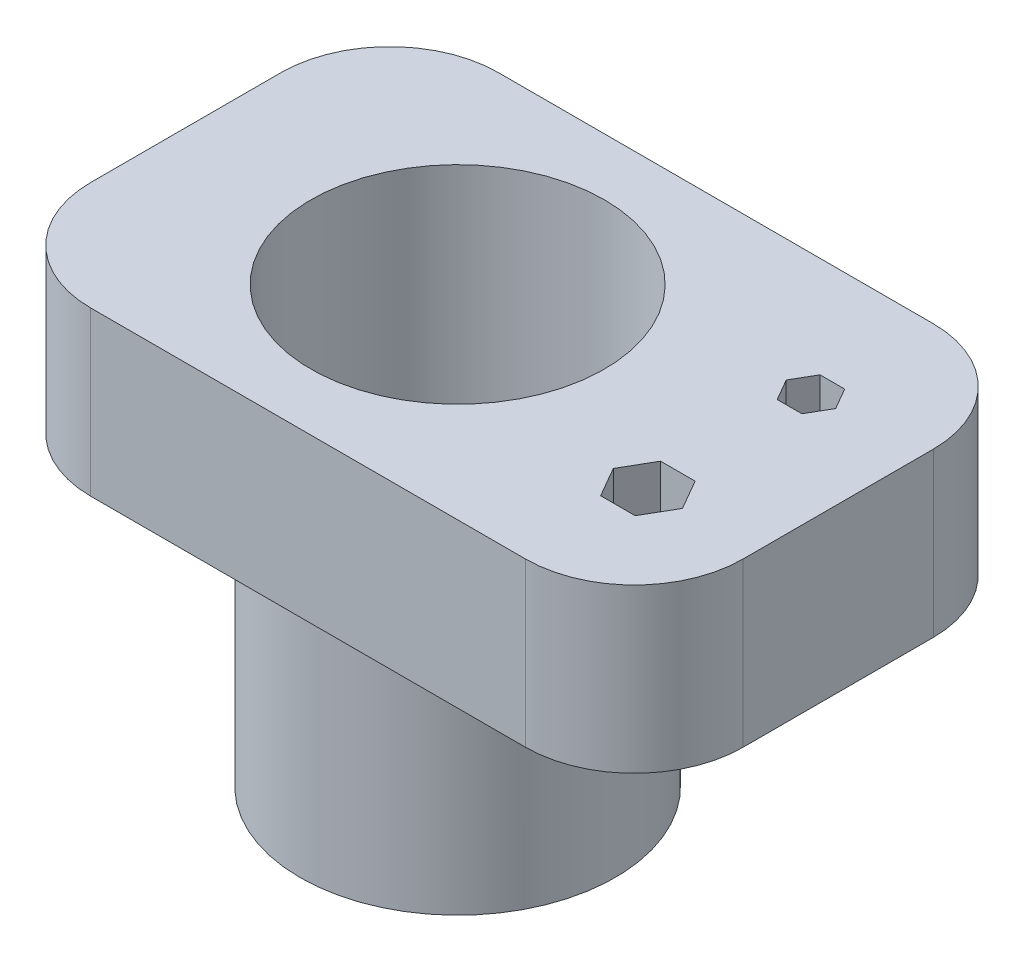
ISO-10303-21;
HEADER;
FILE_DESCRIPTION(('STEP AP214'),'2;1');
FILE_NAME('part.step','',(''),(''),'','','');
FILE_SCHEMA(('AUTOMOTIVE_DESIGN { 1 0 10303 214 1 1 1 1 }'));
ENDSEC;
DATA;
#1=APPLICATION_CONTEXT('core data for automotive mechanical design processes');
#2=APPLICATION_PROTOCOL_DEFINITION('international standard','automotive_design',2000,#1);
#3=PRODUCT_CONTEXT('',#1,'mechanical');
#4=PRODUCT('Part','Part','',(#3));
#5=PRODUCT_RELATED_PRODUCT_CATEGORY('part','',(#4));
#6=PRODUCT_DEFINITION_FORMATION('','',#4);
#7=PRODUCT_DEFINITION_CONTEXT('part definition',#1,'design');
#8=PRODUCT_DEFINITION('design','',#6,#7);
#9=PRODUCT_DEFINITION_SHAPE('','',#8);
#10=(LENGTH_UNIT() NAMED_UNIT(*) SI_UNIT(.MILLI.,.METRE.));
#11=(NAMED_UNIT(*) PLANE_ANGLE_UNIT() SI_UNIT($,.RADIAN.));
#12=(NAMED_UNIT(*) SI_UNIT($,.STERADIAN.) SOLID_ANGLE_UNIT());
#13=UNCERTAINTY_MEASURE_WITH_UNIT(LENGTH_MEASURE(1.E-05),#10,'distance_accuracy_value','');
#14=(GEOMETRIC_REPRESENTATION_CONTEXT(3) GLOBAL_UNCERTAINTY_ASSIGNED_CONTEXT((#13)) GLOBAL_UNIT_ASSIGNED_CONTEXT((#10,
#11,#12)) REPRESENTATION_CONTEXT('',''));
#15=CARTESIAN_POINT('',(0.,0.,0.));
#16=DIRECTION('',(0.,0.,1.));
#17=DIRECTION('',(1.,0.,0.));
#18=AXIS2_PLACEMENT_3D('',#15,#16,#17);
#19=CARTESIAN_POINT('',(0.,6.35,0.));
#20=DIRECTION('',(0.,-1.,0.));
#21=DIRECTION('',(0.,0.,-1.));
#22=AXIS2_PLACEMENT_3D('',#19,#20,#21);
#23=CYLINDRICAL_SURFACE('',#22,3.683);
#24=CARTESIAN_POINT('',(0.,6.35,0.));
#25=DIRECTION('',(0.,1.,0.));
#26=DIRECTION('',(0.,0.,1.));
#27=AXIS2_PLACEMENT_3D('',#24,#25,#26);
#28=CIRCLE('',#27,3.683);
#29=CARTESIAN_POINT('',(0.,6.35,3.683));
#30=VERTEX_POINT('',#29);
#31=EDGE_CURVE('E357',#30,#30,#28,.T.);
#32=ORIENTED_EDGE('',*,*,#31,.F.);
#33=EDGE_LOOP('',(#32));
#34=FACE_BOUND('',#33,.T.);
#35=CARTESIAN_POINT('',(0.,0.,0.));
#36=DIRECTION('',(0.,1.,0.));
#37=DIRECTION('',(0.,0.,1.));
#38=AXIS2_PLACEMENT_3D('',#35,#36,#37);
#39=CIRCLE('',#38,3.683);
#40=CARTESIAN_POINT('',(0.,0.,3.683));
#41=VERTEX_POINT('',#40);
#42=EDGE_CURVE('E343',#41,#41,#39,.T.);
#43=ORIENTED_EDGE('',*,*,#42,.T.);
#44=EDGE_LOOP('',(#43));
#45=FACE_BOUND('',#44,.T.);
#46=ADVANCED_FACE('F41',(#34,#45),#23,.T.);
#47=CARTESIAN_POINT('',(0.,6.35,0.));
#48=DIRECTION('',(0.,-1.,0.));
#49=DIRECTION('',(0.,0.,-1.));
#50=AXIS2_PLACEMENT_3D('',#47,#48,#49);
#51=CYLINDRICAL_SURFACE('',#50,3.429);
#52=CARTESIAN_POINT('',(0.,1.10716033165933,0.));
#53=DIRECTION('',(0.,-1.,0.));
#54=DIRECTION('',(0.,0.,-1.));
#55=AXIS2_PLACEMENT_3D('',#52,#53,#54);
#56=CIRCLE('',#55,3.429);
#57=CARTESIAN_POINT('',(0.,1.10716033165933,-3.429));
#58=VERTEX_POINT('',#57);
#59=EDGE_CURVE('E361',#58,#58,#56,.T.);
#60=ORIENTED_EDGE('',*,*,#59,.T.);
#61=EDGE_LOOP('',(#60));
#62=FACE_BOUND('',#61,.T.);
#63=CARTESIAN_POINT('',(0.,10.16,0.));
#64=DIRECTION('',(0.,-1.,0.));
#65=DIRECTION('',(0.,0.,-1.));
#66=AXIS2_PLACEMENT_3D('',#63,#64,#65);
#67=CIRCLE('',#66,3.429);
#68=CARTESIAN_POINT('',(0.,10.16,-3.429));
#69=VERTEX_POINT('',#68);
#70=EDGE_CURVE('E247',#69,#69,#67,.T.);
#71=ORIENTED_EDGE('',*,*,#70,.F.);
#72=EDGE_LOOP('',(#71));
#73=FACE_BOUND('',#72,.T.);
#74=ADVANCED_FACE('F450',(#62,#73),#51,.F.);
#75=CARTESIAN_POINT('',(0.,1.10716033165933,0.));
#76=DIRECTION('',(0.,-1.,0.));
#77=DIRECTION('',(0.,0.,-1.));
#78=AXIS2_PLACEMENT_3D('',#75,#76,#77);
#79=TOROIDAL_SURFACE('',#78,5.969,2.54);
#80=ORIENTED_EDGE('',*,*,#59,.F.);
#81=EDGE_LOOP('',(#80));
#82=FACE_BOUND('',#81,.T.);
#83=ORIENTED_EDGE('',*,*,#42,.F.);
#84=EDGE_LOOP('',(#83));
#85=FACE_BOUND('',#84,.T.);
#86=ADVANCED_FACE('F456',(#82,#85),#79,.T.);
#87=CARTESIAN_POINT('',(-6.35,10.16,-4.7625));
#88=DIRECTION('',(1.,0.,0.));
#89=DIRECTION('',(0.,0.,-1.));
#90=AXIS2_PLACEMENT_3D('',#87,#88,#89);
#91=PLANE('',#90);
#92=DIRECTION('',(0.,0.,1.));
#93=VECTOR('',#92,1.);
#94=CARTESIAN_POINT('',(-6.35,6.35,-4.7625));
#95=LINE('',#94,#93);
#96=CARTESIAN_POINT('',(-6.35,6.35,-2.2225));
#97=VERTEX_POINT('',#96);
#98=CARTESIAN_POINT('',(-6.35,6.35,2.2225));
#99=VERTEX_POINT('',#98);
#100=EDGE_CURVE('E327',#97,#99,#95,.T.);
#101=ORIENTED_EDGE('',*,*,#100,.T.);
#102=DIRECTION('',(0.,-1.,0.));
#103=VECTOR('',#102,1.);
#104=CARTESIAN_POINT('',(-6.35,10.16,2.2225));
#105=LINE('',#104,#103);
#106=CARTESIAN_POINT('',(-6.35,10.16,2.2225));
#107=VERTEX_POINT('',#106);
#108=EDGE_CURVE('E391',#99,#107,#105,.F.);
#109=ORIENTED_EDGE('',*,*,#108,.T.);
#110=DIRECTION('',(0.,0.,1.));
#111=VECTOR('',#110,1.);
#112=CARTESIAN_POINT('',(-6.35,10.16,-4.7625));
#113=LINE('',#112,#111);
#114=CARTESIAN_POINT('',(-6.35,10.16,-2.2225));
#115=VERTEX_POINT('',#114);
#116=EDGE_CURVE('E328',#115,#107,#113,.T.);
#117=ORIENTED_EDGE('',*,*,#116,.F.);
#118=DIRECTION('',(0.,-1.,0.));
#119=VECTOR('',#118,1.);
#120=CARTESIAN_POINT('',(-6.35,10.16,-2.2225));
#121=LINE('',#120,#119);
#122=EDGE_CURVE('E387',#115,#97,#121,.T.);
#123=ORIENTED_EDGE('',*,*,#122,.T.);
#124=EDGE_LOOP('',(#101,#109,#117,#123));
#125=FACE_BOUND('',#124,.T.);
#126=ADVANCED_FACE('F435',(#125),#91,.F.);
#127=CARTESIAN_POINT('',(8.89,10.16,4.7625));
#128=DIRECTION('',(0.,0.,-1.));
#129=DIRECTION('',(-1.,0.,0.));
#130=AXIS2_PLACEMENT_3D('',#127,#128,#129);
#131=PLANE('',#130);
#132=DIRECTION('',(1.,0.,0.));
#133=VECTOR('',#132,1.);
#134=CARTESIAN_POINT('',(8.89,10.16,4.7625));
#135=LINE('',#134,#133);
#136=CARTESIAN_POINT('',(-3.81,10.16,4.7625));
#137=VERTEX_POINT('',#136);
#138=CARTESIAN_POINT('',(6.35,10.16,4.7625));
#139=VERTEX_POINT('',#138);
#140=EDGE_CURVE('E332',#137,#139,#135,.T.);
#141=ORIENTED_EDGE('',*,*,#140,.F.);
#142=DIRECTION('',(0.,-1.,0.));
#143=VECTOR('',#142,1.);
#144=CARTESIAN_POINT('',(-3.81,10.16,4.7625));
#145=LINE('',#144,#143);
#146=CARTESIAN_POINT('',(-3.81,6.35,4.7625));
#147=VERTEX_POINT('',#146);
#148=EDGE_CURVE('E371',#137,#147,#145,.T.);
#149=ORIENTED_EDGE('',*,*,#148,.T.);
#150=DIRECTION('',(1.,0.,0.));
#151=VECTOR('',#150,1.);
#152=CARTESIAN_POINT('',(8.89,6.35,4.7625));
#153=LINE('',#152,#151);
#154=CARTESIAN_POINT('',(6.35,6.35,4.7625));
#155=VERTEX_POINT('',#154);
#156=EDGE_CURVE('E347',#147,#155,#153,.T.);
#157=ORIENTED_EDGE('',*,*,#156,.T.);
#158=DIRECTION('',(0.,-1.,0.));
#159=VECTOR('',#158,1.);
#160=CARTESIAN_POINT('',(6.35,10.16,4.7625));
#161=LINE('',#160,#159);
#162=EDGE_CURVE('E368',#155,#139,#161,.F.);
#163=ORIENTED_EDGE('',*,*,#162,.T.);
#164=EDGE_LOOP('',(#141,#149,#157,#163));
#165=FACE_BOUND('',#164,.T.);
#166=ADVANCED_FACE('F443',(#165),#131,.F.);
#167=CARTESIAN_POINT('',(8.89,10.16,-4.7625));
#168=DIRECTION('',(-1.,0.,0.));
#169=DIRECTION('',(0.,0.,1.));
#170=AXIS2_PLACEMENT_3D('',#167,#168,#169);
#171=PLANE('',#170);
#172=DIRECTION('',(0.,0.,-1.));
#173=VECTOR('',#172,1.);
#174=CARTESIAN_POINT('',(8.89,6.35,-4.7625));
#175=LINE('',#174,#173);
#176=CARTESIAN_POINT('',(8.89,6.35,2.2225));
#177=VERTEX_POINT('',#176);
#178=CARTESIAN_POINT('',(8.89,6.35,-2.2225));
#179=VERTEX_POINT('',#178);
#180=EDGE_CURVE('E351',#177,#179,#175,.T.);
#181=ORIENTED_EDGE('',*,*,#180,.T.);
#182=DIRECTION('',(0.,-1.,0.));
#183=VECTOR('',#182,1.);
#184=CARTESIAN_POINT('',(8.89,10.16,-2.2225));
#185=LINE('',#184,#183);
#186=CARTESIAN_POINT('',(8.89,10.16,-2.2225));
#187=VERTEX_POINT('',#186);
#188=EDGE_CURVE('E11',#179,#187,#185,.F.);
#189=ORIENTED_EDGE('',*,*,#188,.T.);
#190=DIRECTION('',(0.,0.,-1.));
#191=VECTOR('',#190,1.);
#192=CARTESIAN_POINT('',(8.89,10.16,-4.7625));
#193=LINE('',#192,#191);
#194=CARTESIAN_POINT('',(8.89,10.16,2.2225));
#195=VERTEX_POINT('',#194);
#196=EDGE_CURVE('E337',#195,#187,#193,.T.);
#197=ORIENTED_EDGE('',*,*,#196,.F.);
#198=DIRECTION('',(0.,-1.,0.));
#199=VECTOR('',#198,1.);
#200=CARTESIAN_POINT('',(8.89,10.16,2.2225));
#201=LINE('',#200,#199);
#202=EDGE_CURVE('E50',#195,#177,#201,.T.);
#203=ORIENTED_EDGE('',*,*,#202,.T.);
#204=EDGE_LOOP('',(#181,#189,#197,#203));
#205=FACE_BOUND('',#204,.T.);
#206=ADVANCED_FACE('F416',(#205),#171,.F.);
#207=CARTESIAN_POINT('',(8.89,10.16,-4.7625));
#208=DIRECTION('',(0.,0.,1.));
#209=DIRECTION('',(1.,0.,0.));
#210=AXIS2_PLACEMENT_3D('',#207,#208,#209);
#211=PLANE('',#210);
#212=DIRECTION('',(-1.,0.,0.));
#213=VECTOR('',#212,1.);
#214=CARTESIAN_POINT('',(8.89,6.35,-4.7625));
#215=LINE('',#214,#213);
#216=CARTESIAN_POINT('',(6.35,6.35,-4.7625));
#217=VERTEX_POINT('',#216);
#218=CARTESIAN_POINT('',(-3.81,6.35,-4.7625));
#219=VERTEX_POINT('',#218);
#220=EDGE_CURVE('E333',#217,#219,#215,.T.);
#221=ORIENTED_EDGE('',*,*,#220,.T.);
#222=DIRECTION('',(0.,-1.,0.));
#223=VECTOR('',#222,1.);
#224=CARTESIAN_POINT('',(-3.81,10.16,-4.7625));
#225=LINE('',#224,#223);
#226=CARTESIAN_POINT('',(-3.81,10.16,-4.7625));
#227=VERTEX_POINT('',#226);
#228=EDGE_CURVE('E57',#219,#227,#225,.F.);
#229=ORIENTED_EDGE('',*,*,#228,.T.);
#230=DIRECTION('',(-1.,0.,0.));
#231=VECTOR('',#230,1.);
#232=CARTESIAN_POINT('',(8.89,10.16,-4.7625));
#233=LINE('',#232,#231);
#234=CARTESIAN_POINT('',(6.35,10.16,-4.7625));
#235=VERTEX_POINT('',#234);
#236=EDGE_CURVE('E340',#235,#227,#233,.T.);
#237=ORIENTED_EDGE('',*,*,#236,.F.);
#238=DIRECTION('',(0.,-1.,0.));
#239=VECTOR('',#238,1.);
#240=CARTESIAN_POINT('',(6.35,10.16,-4.7625));
#241=LINE('',#240,#239);
#242=EDGE_CURVE('E405',#235,#217,#241,.T.);
#243=ORIENTED_EDGE('',*,*,#242,.T.);
#244=EDGE_LOOP('',(#221,#229,#237,#243));
#245=FACE_BOUND('',#244,.T.);
#246=ADVANCED_FACE('F426',(#245),#211,.F.);
#247=CARTESIAN_POINT('',(0.,10.16,0.));
#248=DIRECTION('',(0.,-1.,0.));
#249=DIRECTION('',(0.,0.,-1.));
#250=AXIS2_PLACEMENT_3D('',#247,#248,#249);
#251=PLANE('',#250);
#252=DIRECTION('',(1.,0.,0.));
#253=VECTOR('',#252,1.);
#254=CARTESIAN_POINT('',(6.06132486540519,10.16,-1.405));
#255=LINE('',#254,#253);
#256=CARTESIAN_POINT('',(6.06132486540519,10.16,-1.405));
#257=VERTEX_POINT('',#256);
#258=CARTESIAN_POINT('',(6.63867513459482,10.16,-1.405));
#259=VERTEX_POINT('',#258);
#260=EDGE_CURVE('E229',#257,#259,#255,.T.);
#261=ORIENTED_EDGE('',*,*,#260,.F.);
#262=DIRECTION('',(0.5,0.,0.866025403784439));
#263=VECTOR('',#262,1.);
#264=CARTESIAN_POINT('',(5.77264973081038,10.16,-1.905));
#265=LINE('',#264,#263);
#266=CARTESIAN_POINT('',(5.77264973081038,10.16,-1.905));
#267=VERTEX_POINT('',#266);
#268=EDGE_CURVE('E187',#267,#257,#265,.T.);
#269=ORIENTED_EDGE('',*,*,#268,.F.);
#270=DIRECTION('',(-0.5,0.,0.866025403784438));
#271=VECTOR('',#270,1.);
#272=CARTESIAN_POINT('',(6.06132486540519,10.16,-2.405));
#273=LINE('',#272,#271);
#274=CARTESIAN_POINT('',(6.06132486540519,10.16,-2.405));
#275=VERTEX_POINT('',#274);
#276=EDGE_CURVE('E209',#275,#267,#273,.T.);
#277=ORIENTED_EDGE('',*,*,#276,.F.);
#278=DIRECTION('',(-1.,0.,0.));
#279=VECTOR('',#278,1.);
#280=CARTESIAN_POINT('',(6.63867513459481,10.16,-2.405));
#281=LINE('',#280,#279);
#282=CARTESIAN_POINT('',(6.63867513459481,10.16,-2.405));
#283=VERTEX_POINT('',#282);
#284=EDGE_CURVE('E213',#283,#275,#281,.T.);
#285=ORIENTED_EDGE('',*,*,#284,.F.);
#286=DIRECTION('',(-0.5,0.,-0.866025403784438));
#287=VECTOR('',#286,1.);
#288=CARTESIAN_POINT('',(6.92735026918963,10.16,-1.905));
#289=LINE('',#288,#287);
#290=CARTESIAN_POINT('',(6.92735026918963,10.16,-1.905));
#291=VERTEX_POINT('',#290);
#292=EDGE_CURVE('E237',#291,#283,#289,.T.);
#293=ORIENTED_EDGE('',*,*,#292,.F.);
#294=DIRECTION('',(0.5,0.,-0.866025403784438));
#295=VECTOR('',#294,1.);
#296=CARTESIAN_POINT('',(6.63867513459482,10.16,-1.405));
#297=LINE('',#296,#295);
#298=EDGE_CURVE('E233',#259,#291,#297,.T.);
#299=ORIENTED_EDGE('',*,*,#298,.F.);
#300=EDGE_LOOP('',(#261,#269,#277,#285,#293,#299));
#301=FACE_BOUND('',#300,.T.);
#302=DIRECTION('',(-0.5,0.,-0.866025403784438));
#303=VECTOR('',#302,1.);
#304=CARTESIAN_POINT('',(7.15829037686547,10.16,1.905));
#305=LINE('',#304,#303);
#306=CARTESIAN_POINT('',(7.15829037686547,10.16,1.905));
#307=VERTEX_POINT('',#306);
#308=CARTESIAN_POINT('',(6.75414518843274,10.16,1.205));
#309=VERTEX_POINT('',#308);
#310=EDGE_CURVE('E288',#307,#309,#305,.T.);
#311=ORIENTED_EDGE('',*,*,#310,.F.);
#312=DIRECTION('',(0.5,0.,-0.866025403784439));
#313=VECTOR('',#312,1.);
#314=CARTESIAN_POINT('',(6.75414518843274,10.16,2.605));
#315=LINE('',#314,#313);
#316=CARTESIAN_POINT('',(6.75414518843274,10.16,2.605));
#317=VERTEX_POINT('',#316);
#318=EDGE_CURVE('E285',#317,#307,#315,.T.);
#319=ORIENTED_EDGE('',*,*,#318,.F.);
#320=DIRECTION('',(1.,0.,0.));
#321=VECTOR('',#320,1.);
#322=CARTESIAN_POINT('',(5.94585481156726,10.16,2.605));
#323=LINE('',#322,#321);
#324=CARTESIAN_POINT('',(5.94585481156726,10.16,2.605));
#325=VERTEX_POINT('',#324);
#326=EDGE_CURVE('E264',#325,#317,#323,.T.);
#327=ORIENTED_EDGE('',*,*,#326,.F.);
#328=DIRECTION('',(0.5,0.,0.866025403784439));
#329=VECTOR('',#328,1.);
#330=CARTESIAN_POINT('',(5.54170962313453,10.16,1.905));
#331=LINE('',#330,#329);
#332=CARTESIAN_POINT('',(5.54170962313453,10.16,1.905));
#333=VERTEX_POINT('',#332);
#334=EDGE_CURVE('E300',#333,#325,#331,.T.);
#335=ORIENTED_EDGE('',*,*,#334,.F.);
#336=DIRECTION('',(-0.5,0.,0.866025403784439));
#337=VECTOR('',#336,1.);
#338=CARTESIAN_POINT('',(5.94585481156726,10.16,1.205));
#339=LINE('',#338,#337);
#340=CARTESIAN_POINT('',(5.94585481156726,10.16,1.205));
#341=VERTEX_POINT('',#340);
#342=EDGE_CURVE('E296',#341,#333,#339,.T.);
#343=ORIENTED_EDGE('',*,*,#342,.F.);
#344=DIRECTION('',(-1.,0.,0.));
#345=VECTOR('',#344,1.);
#346=CARTESIAN_POINT('',(6.75414518843274,10.16,1.205));
#347=LINE('',#346,#345);
#348=EDGE_CURVE('E292',#309,#341,#347,.T.);
#349=ORIENTED_EDGE('',*,*,#348,.F.);
#350=EDGE_LOOP('',(#311,#319,#327,#335,#343,#349));
#351=FACE_BOUND('',#350,.T.);
#352=ORIENTED_EDGE('',*,*,#70,.T.);
#353=EDGE_LOOP('',(#352));
#354=FACE_BOUND('',#353,.T.);
#355=ORIENTED_EDGE('',*,*,#116,.T.);
#356=CARTESIAN_POINT('',(-3.81,10.16,2.2225));
#357=DIRECTION('',(0.,-1.,0.));
#358=DIRECTION('',(0.,0.,-1.));
#359=AXIS2_PLACEMENT_3D('',#356,#357,#358);
#360=CIRCLE('',#359,2.54);
#361=EDGE_CURVE('E402',#107,#137,#360,.F.);
#362=ORIENTED_EDGE('',*,*,#361,.T.);
#363=ORIENTED_EDGE('',*,*,#140,.T.);
#364=CARTESIAN_POINT('',(6.35,10.16,2.2225));
#365=DIRECTION('',(0.,-1.,0.));
#366=DIRECTION('',(0.,0.,-1.));
#367=AXIS2_PLACEMENT_3D('',#364,#365,#366);
#368=CIRCLE('',#367,2.54);
#369=EDGE_CURVE('E394',#139,#195,#368,.F.);
#370=ORIENTED_EDGE('',*,*,#369,.T.);
#371=ORIENTED_EDGE('',*,*,#196,.T.);
#372=CARTESIAN_POINT('',(6.35,10.16,-2.2225));
#373=DIRECTION('',(0.,-1.,0.));
#374=DIRECTION('',(0.,0.,-1.));
#375=AXIS2_PLACEMENT_3D('',#372,#373,#374);
#376=CIRCLE('',#375,2.54);
#377=EDGE_CURVE('E64',#187,#235,#376,.F.);
#378=ORIENTED_EDGE('',*,*,#377,.T.);
#379=ORIENTED_EDGE('',*,*,#236,.T.);
#380=CARTESIAN_POINT('',(-3.81,10.16,-2.2225));
#381=DIRECTION('',(0.,-1.,0.));
#382=DIRECTION('',(0.,0.,-1.));
#383=AXIS2_PLACEMENT_3D('',#380,#381,#382);
#384=CIRCLE('',#383,2.54);
#385=EDGE_CURVE('E399',#227,#115,#384,.F.);
#386=ORIENTED_EDGE('',*,*,#385,.T.);
#387=EDGE_LOOP('',(#355,#362,#363,#370,#371,#378,#379,#386));
#388=FACE_BOUND('',#387,.T.);
#389=ADVANCED_FACE('F428',(#301,#351,#354,#388),#251,.F.);
#390=CARTESIAN_POINT('',(0.,6.35,0.));
#391=DIRECTION('',(0.,-1.,0.));
#392=DIRECTION('',(0.,0.,-1.));
#393=AXIS2_PLACEMENT_3D('',#390,#391,#392);
#394=PLANE('',#393);
#395=DIRECTION('',(0.5,0.,0.866025403784439));
#396=VECTOR('',#395,1.);
#397=CARTESIAN_POINT('',(5.77264973081038,6.35,-1.905));
#398=LINE('',#397,#396);
#399=CARTESIAN_POINT('',(5.77264973081038,6.35,-1.905));
#400=VERTEX_POINT('',#399);
#401=CARTESIAN_POINT('',(6.06132486540519,6.35,-1.405));
#402=VERTEX_POINT('',#401);
#403=EDGE_CURVE('E184',#400,#402,#398,.T.);
#404=ORIENTED_EDGE('',*,*,#403,.T.);
#405=DIRECTION('',(1.,0.,0.));
#406=VECTOR('',#405,1.);
#407=CARTESIAN_POINT('',(6.06132486540519,6.35,-1.405));
#408=LINE('',#407,#406);
#409=CARTESIAN_POINT('',(6.63867513459482,6.35,-1.405));
#410=VERTEX_POINT('',#409);
#411=EDGE_CURVE('E197',#402,#410,#408,.T.);
#412=ORIENTED_EDGE('',*,*,#411,.T.);
#413=DIRECTION('',(0.5,0.,-0.866025403784438));
#414=VECTOR('',#413,1.);
#415=CARTESIAN_POINT('',(6.63867513459482,6.35,-1.405));
#416=LINE('',#415,#414);
#417=CARTESIAN_POINT('',(6.92735026918963,6.35,-1.905));
#418=VERTEX_POINT('',#417);
#419=EDGE_CURVE('E202',#410,#418,#416,.T.);
#420=ORIENTED_EDGE('',*,*,#419,.T.);
#421=DIRECTION('',(-0.5,0.,-0.866025403784438));
#422=VECTOR('',#421,1.);
#423=CARTESIAN_POINT('',(6.92735026918963,6.35,-1.905));
#424=LINE('',#423,#422);
#425=CARTESIAN_POINT('',(6.63867513459481,6.35,-2.405));
#426=VERTEX_POINT('',#425);
#427=EDGE_CURVE('E218',#418,#426,#424,.T.);
#428=ORIENTED_EDGE('',*,*,#427,.T.);
#429=DIRECTION('',(-1.,0.,0.));
#430=VECTOR('',#429,1.);
#431=CARTESIAN_POINT('',(6.63867513459481,6.35,-2.405));
#432=LINE('',#431,#430);
#433=CARTESIAN_POINT('',(6.06132486540519,6.35,-2.405));
#434=VERTEX_POINT('',#433);
#435=EDGE_CURVE('E222',#426,#434,#432,.T.);
#436=ORIENTED_EDGE('',*,*,#435,.T.);
#437=DIRECTION('',(-0.5,0.,0.866025403784438));
#438=VECTOR('',#437,1.);
#439=CARTESIAN_POINT('',(6.06132486540519,6.35,-2.405));
#440=LINE('',#439,#438);
#441=EDGE_CURVE('E193',#434,#400,#440,.T.);
#442=ORIENTED_EDGE('',*,*,#441,.T.);
#443=EDGE_LOOP('',(#404,#412,#420,#428,#436,#442));
#444=FACE_BOUND('',#443,.T.);
#445=DIRECTION('',(0.5,0.,-0.866025403784439));
#446=VECTOR('',#445,1.);
#447=CARTESIAN_POINT('',(6.75414518843274,6.35,2.605));
#448=LINE('',#447,#446);
#449=CARTESIAN_POINT('',(6.75414518843274,6.35,2.605));
#450=VERTEX_POINT('',#449);
#451=CARTESIAN_POINT('',(7.15829037686547,6.35,1.905));
#452=VERTEX_POINT('',#451);
#453=EDGE_CURVE('E259',#450,#452,#448,.T.);
#454=ORIENTED_EDGE('',*,*,#453,.T.);
#455=DIRECTION('',(-0.5,0.,-0.866025403784438));
#456=VECTOR('',#455,1.);
#457=CARTESIAN_POINT('',(7.15829037686547,6.35,1.905));
#458=LINE('',#457,#456);
#459=CARTESIAN_POINT('',(6.75414518843274,6.35,1.205));
#460=VERTEX_POINT('',#459);
#461=EDGE_CURVE('E263',#452,#460,#458,.T.);
#462=ORIENTED_EDGE('',*,*,#461,.T.);
#463=DIRECTION('',(-1.,0.,0.));
#464=VECTOR('',#463,1.);
#465=CARTESIAN_POINT('',(6.75414518843274,6.35,1.205));
#466=LINE('',#465,#464);
#467=CARTESIAN_POINT('',(5.94585481156726,6.35,1.205));
#468=VERTEX_POINT('',#467);
#469=EDGE_CURVE('E268',#460,#468,#466,.T.);
#470=ORIENTED_EDGE('',*,*,#469,.T.);
#471=DIRECTION('',(-0.5,0.,0.866025403784439));
#472=VECTOR('',#471,1.);
#473=CARTESIAN_POINT('',(5.94585481156726,6.35,1.205));
#474=LINE('',#473,#472);
#475=CARTESIAN_POINT('',(5.54170962313453,6.35,1.905));
#476=VERTEX_POINT('',#475);
#477=EDGE_CURVE('E272',#468,#476,#474,.T.);
#478=ORIENTED_EDGE('',*,*,#477,.T.);
#479=DIRECTION('',(0.5,0.,0.866025403784439));
#480=VECTOR('',#479,1.);
#481=CARTESIAN_POINT('',(5.54170962313453,6.35,1.905));
#482=LINE('',#481,#480);
#483=CARTESIAN_POINT('',(5.94585481156726,6.35,2.605));
#484=VERTEX_POINT('',#483);
#485=EDGE_CURVE('E276',#476,#484,#482,.T.);
#486=ORIENTED_EDGE('',*,*,#485,.T.);
#487=DIRECTION('',(1.,0.,0.));
#488=VECTOR('',#487,1.);
#489=CARTESIAN_POINT('',(5.94585481156726,6.35,2.605));
#490=LINE('',#489,#488);
#491=EDGE_CURVE('E280',#484,#450,#490,.T.);
#492=ORIENTED_EDGE('',*,*,#491,.T.);
#493=EDGE_LOOP('',(#454,#462,#470,#478,#486,#492));
#494=FACE_BOUND('',#493,.T.);
#495=ORIENTED_EDGE('',*,*,#31,.T.);
#496=EDGE_LOOP('',(#495));
#497=FACE_BOUND('',#496,.T.);
#498=ORIENTED_EDGE('',*,*,#156,.F.);
#499=CARTESIAN_POINT('',(-3.81,6.35,2.2225));
#500=DIRECTION('',(0.,-1.,0.));
#501=DIRECTION('',(0.,0.,-1.));
#502=AXIS2_PLACEMENT_3D('',#499,#500,#501);
#503=CIRCLE('',#502,2.54);
#504=EDGE_CURVE('E384',#147,#99,#503,.T.);
#505=ORIENTED_EDGE('',*,*,#504,.T.);
#506=ORIENTED_EDGE('',*,*,#100,.F.);
#507=CARTESIAN_POINT('',(-3.81,6.35,-2.2225));
#508=DIRECTION('',(0.,-1.,0.));
#509=DIRECTION('',(0.,0.,-1.));
#510=AXIS2_PLACEMENT_3D('',#507,#508,#509);
#511=CIRCLE('',#510,2.54);
#512=EDGE_CURVE('E381',#97,#219,#511,.T.);
#513=ORIENTED_EDGE('',*,*,#512,.T.);
#514=ORIENTED_EDGE('',*,*,#220,.F.);
#515=CARTESIAN_POINT('',(6.35,6.35,-2.2225));
#516=DIRECTION('',(0.,-1.,0.));
#517=DIRECTION('',(0.,0.,-1.));
#518=AXIS2_PLACEMENT_3D('',#515,#516,#517);
#519=CIRCLE('',#518,2.54);
#520=EDGE_CURVE('E378',#217,#179,#519,.T.);
#521=ORIENTED_EDGE('',*,*,#520,.T.);
#522=ORIENTED_EDGE('',*,*,#180,.F.);
#523=CARTESIAN_POINT('',(6.35,6.35,2.2225));
#524=DIRECTION('',(0.,-1.,0.));
#525=DIRECTION('',(0.,0.,-1.));
#526=AXIS2_PLACEMENT_3D('',#523,#524,#525);
#527=CIRCLE('',#526,2.54);
#528=EDGE_CURVE('E375',#177,#155,#527,.T.);
#529=ORIENTED_EDGE('',*,*,#528,.T.);
#530=EDGE_LOOP('',(#498,#505,#506,#513,#514,#521,#522,#529));
#531=FACE_BOUND('',#530,.T.);
#532=ADVANCED_FACE('F204',(#444,#494,#497,#531),#394,.T.);
#533=CARTESIAN_POINT('',(6.75414518843274,6.35,2.605));
#534=DIRECTION('',(0.866025403784439,0.,0.5));
#535=DIRECTION('',(0.5,0.,-0.866025403784439));
#536=AXIS2_PLACEMENT_3D('',#533,#534,#535);
#537=PLANE('',#536);
#538=ORIENTED_EDGE('',*,*,#318,.T.);
#539=DIRECTION('',(0.,1.,0.));
#540=VECTOR('',#539,1.);
#541=CARTESIAN_POINT('',(7.15829037686547,6.35,1.905));
#542=LINE('',#541,#540);
#543=EDGE_CURVE('E284',#452,#307,#542,.T.);
#544=ORIENTED_EDGE('',*,*,#543,.F.);
#545=ORIENTED_EDGE('',*,*,#453,.F.);
#546=DIRECTION('',(0.,1.,0.));
#547=VECTOR('',#546,1.);
#548=CARTESIAN_POINT('',(6.75414518843274,6.35,2.605));
#549=LINE('',#548,#547);
#550=EDGE_CURVE('E230',#450,#317,#549,.T.);
#551=ORIENTED_EDGE('',*,*,#550,.T.);
#552=EDGE_LOOP('',(#538,#544,#545,#551));
#553=FACE_BOUND('',#552,.T.);
#554=ADVANCED_FACE('F586',(#553),#537,.F.);
#555=CARTESIAN_POINT('',(5.94585481156726,6.35,2.605));
#556=DIRECTION('',(0.,0.,1.));
#557=DIRECTION('',(1.,0.,0.));
#558=AXIS2_PLACEMENT_3D('',#555,#556,#557);
#559=PLANE('',#558);
#560=ORIENTED_EDGE('',*,*,#326,.T.);
#561=ORIENTED_EDGE('',*,*,#550,.F.);
#562=ORIENTED_EDGE('',*,*,#491,.F.);
#563=DIRECTION('',(0.,1.,0.));
#564=VECTOR('',#563,1.);
#565=CARTESIAN_POINT('',(5.94585481156726,6.35,2.605));
#566=LINE('',#565,#564);
#567=EDGE_CURVE('E309',#484,#325,#566,.T.);
#568=ORIENTED_EDGE('',*,*,#567,.T.);
#569=EDGE_LOOP('',(#560,#561,#562,#568));
#570=FACE_BOUND('',#569,.T.);
#571=ADVANCED_FACE('F577',(#570),#559,.F.);
#572=CARTESIAN_POINT('',(5.54170962313453,6.35,1.905));
#573=DIRECTION('',(-0.866025403784439,0.,0.5));
#574=DIRECTION('',(0.5,0.,0.866025403784439));
#575=AXIS2_PLACEMENT_3D('',#572,#573,#574);
#576=PLANE('',#575);
#577=ORIENTED_EDGE('',*,*,#334,.T.);
#578=ORIENTED_EDGE('',*,*,#567,.F.);
#579=ORIENTED_EDGE('',*,*,#485,.F.);
#580=DIRECTION('',(0.,1.,0.));
#581=VECTOR('',#580,1.);
#582=CARTESIAN_POINT('',(5.54170962313453,6.35,1.905));
#583=LINE('',#582,#581);
#584=EDGE_CURVE('E312',#476,#333,#583,.T.);
#585=ORIENTED_EDGE('',*,*,#584,.T.);
#586=EDGE_LOOP('',(#577,#578,#579,#585));
#587=FACE_BOUND('',#586,.T.);
#588=ADVANCED_FACE('F568',(#587),#576,.F.);
#589=CARTESIAN_POINT('',(5.94585481156726,6.35,1.205));
#590=DIRECTION('',(-0.866025403784439,0.,-0.5));
#591=DIRECTION('',(-0.5,0.,0.866025403784439));
#592=AXIS2_PLACEMENT_3D('',#589,#590,#591);
#593=PLANE('',#592);
#594=ORIENTED_EDGE('',*,*,#342,.T.);
#595=ORIENTED_EDGE('',*,*,#584,.F.);
#596=ORIENTED_EDGE('',*,*,#477,.F.);
#597=DIRECTION('',(0.,1.,0.));
#598=VECTOR('',#597,1.);
#599=CARTESIAN_POINT('',(5.94585481156726,6.35,1.205));
#600=LINE('',#599,#598);
#601=EDGE_CURVE('E315',#468,#341,#600,.T.);
#602=ORIENTED_EDGE('',*,*,#601,.T.);
#603=EDGE_LOOP('',(#594,#595,#596,#602));
#604=FACE_BOUND('',#603,.T.);
#605=ADVANCED_FACE('F559',(#604),#593,.F.);
#606=CARTESIAN_POINT('',(6.75414518843274,6.35,1.205));
#607=DIRECTION('',(0.,0.,-1.));
#608=DIRECTION('',(-1.,0.,0.));
#609=AXIS2_PLACEMENT_3D('',#606,#607,#608);
#610=PLANE('',#609);
#611=ORIENTED_EDGE('',*,*,#348,.T.);
#612=ORIENTED_EDGE('',*,*,#601,.F.);
#613=ORIENTED_EDGE('',*,*,#469,.F.);
#614=DIRECTION('',(0.,1.,0.));
#615=VECTOR('',#614,1.);
#616=CARTESIAN_POINT('',(6.75414518843274,6.35,1.205));
#617=LINE('',#616,#615);
#618=EDGE_CURVE('E318',#460,#309,#617,.T.);
#619=ORIENTED_EDGE('',*,*,#618,.T.);
#620=EDGE_LOOP('',(#611,#612,#613,#619));
#621=FACE_BOUND('',#620,.T.);
#622=ADVANCED_FACE('F550',(#621),#610,.F.);
#623=CARTESIAN_POINT('',(7.15829037686547,6.35,1.905));
#624=DIRECTION('',(0.866025403784438,0.,-0.5));
#625=DIRECTION('',(-0.5,0.,-0.866025403784439));
#626=AXIS2_PLACEMENT_3D('',#623,#624,#625);
#627=PLANE('',#626);
#628=ORIENTED_EDGE('',*,*,#310,.T.);
#629=ORIENTED_EDGE('',*,*,#618,.F.);
#630=ORIENTED_EDGE('',*,*,#461,.F.);
#631=ORIENTED_EDGE('',*,*,#543,.T.);
#632=EDGE_LOOP('',(#628,#629,#630,#631));
#633=FACE_BOUND('',#632,.T.);
#634=ADVANCED_FACE('F542',(#633),#627,.F.);
#635=CARTESIAN_POINT('',(5.77264973081038,6.35,-1.905));
#636=DIRECTION('',(-0.866025403784439,0.,0.499999999999999));
#637=DIRECTION('',(0.5,0.,0.866025403784439));
#638=AXIS2_PLACEMENT_3D('',#635,#636,#637);
#639=PLANE('',#638);
#640=ORIENTED_EDGE('',*,*,#268,.T.);
#641=DIRECTION('',(0.,1.,0.));
#642=VECTOR('',#641,1.);
#643=CARTESIAN_POINT('',(6.06132486540519,6.35,-1.405));
#644=LINE('',#643,#642);
#645=EDGE_CURVE('E180',#402,#257,#644,.T.);
#646=ORIENTED_EDGE('',*,*,#645,.F.);
#647=ORIENTED_EDGE('',*,*,#403,.F.);
#648=DIRECTION('',(0.,1.,0.));
#649=VECTOR('',#648,1.);
#650=CARTESIAN_POINT('',(5.77264973081038,6.35,-1.905));
#651=LINE('',#650,#649);
#652=EDGE_CURVE('E244',#400,#267,#651,.T.);
#653=ORIENTED_EDGE('',*,*,#652,.T.);
#654=EDGE_LOOP('',(#640,#646,#647,#653));
#655=FACE_BOUND('',#654,.T.);
#656=ADVANCED_FACE('F182',(#655),#639,.F.);
#657=CARTESIAN_POINT('',(6.06132486540519,6.35,-2.405));
#658=DIRECTION('',(-0.866025403784438,0.,-0.5));
#659=DIRECTION('',(-0.5,0.,0.866025403784438));
#660=AXIS2_PLACEMENT_3D('',#657,#658,#659);
#661=PLANE('',#660);
#662=ORIENTED_EDGE('',*,*,#276,.T.);
#663=ORIENTED_EDGE('',*,*,#652,.F.);
#664=ORIENTED_EDGE('',*,*,#441,.F.);
#665=DIRECTION('',(0.,1.,0.));
#666=VECTOR('',#665,1.);
#667=CARTESIAN_POINT('',(6.06132486540519,6.35,-2.405));
#668=LINE('',#667,#666);
#669=EDGE_CURVE('E248',#434,#275,#668,.T.);
#670=ORIENTED_EDGE('',*,*,#669,.T.);
#671=EDGE_LOOP('',(#662,#663,#664,#670));
#672=FACE_BOUND('',#671,.T.);
#673=ADVANCED_FACE('F525',(#672),#661,.F.);
#674=CARTESIAN_POINT('',(6.63867513459481,6.35,-2.405));
#675=DIRECTION('',(0.,0.,-1.));
#676=DIRECTION('',(-1.,0.,0.));
#677=AXIS2_PLACEMENT_3D('',#674,#675,#676);
#678=PLANE('',#677);
#679=ORIENTED_EDGE('',*,*,#284,.T.);
#680=ORIENTED_EDGE('',*,*,#669,.F.);
#681=ORIENTED_EDGE('',*,*,#435,.F.);
#682=DIRECTION('',(0.,1.,0.));
#683=VECTOR('',#682,1.);
#684=CARTESIAN_POINT('',(6.63867513459481,6.35,-2.405));
#685=LINE('',#684,#683);
#686=EDGE_CURVE('E251',#426,#283,#685,.T.);
#687=ORIENTED_EDGE('',*,*,#686,.T.);
#688=EDGE_LOOP('',(#679,#680,#681,#687));
#689=FACE_BOUND('',#688,.T.);
#690=ADVANCED_FACE('F516',(#689),#678,.F.);
#691=CARTESIAN_POINT('',(6.92735026918963,6.35,-1.905));
#692=DIRECTION('',(0.866025403784438,0.,-0.5));
#693=DIRECTION('',(-0.5,0.,-0.866025403784438));
#694=AXIS2_PLACEMENT_3D('',#691,#692,#693);
#695=PLANE('',#694);
#696=ORIENTED_EDGE('',*,*,#292,.T.);
#697=ORIENTED_EDGE('',*,*,#686,.F.);
#698=ORIENTED_EDGE('',*,*,#427,.F.);
#699=DIRECTION('',(0.,1.,0.));
#700=VECTOR('',#699,1.);
#701=CARTESIAN_POINT('',(6.92735026918963,6.35,-1.905));
#702=LINE('',#701,#700);
#703=EDGE_CURVE('E254',#418,#291,#702,.T.);
#704=ORIENTED_EDGE('',*,*,#703,.T.);
#705=EDGE_LOOP('',(#696,#697,#698,#704));
#706=FACE_BOUND('',#705,.T.);
#707=ADVANCED_FACE('F507',(#706),#695,.F.);
#708=CARTESIAN_POINT('',(6.63867513459482,6.35,-1.405));
#709=DIRECTION('',(0.866025403784438,0.,0.5));
#710=DIRECTION('',(0.5,0.,-0.866025403784438));
#711=AXIS2_PLACEMENT_3D('',#708,#709,#710);
#712=PLANE('',#711);
#713=ORIENTED_EDGE('',*,*,#298,.T.);
#714=ORIENTED_EDGE('',*,*,#703,.F.);
#715=ORIENTED_EDGE('',*,*,#419,.F.);
#716=DIRECTION('',(0.,1.,0.));
#717=VECTOR('',#716,1.);
#718=CARTESIAN_POINT('',(6.63867513459482,6.35,-1.405));
#719=LINE('',#718,#717);
#720=EDGE_CURVE('E192',#410,#259,#719,.T.);
#721=ORIENTED_EDGE('',*,*,#720,.T.);
#722=EDGE_LOOP('',(#713,#714,#715,#721));
#723=FACE_BOUND('',#722,.T.);
#724=ADVANCED_FACE('F498',(#723),#712,.F.);
#725=CARTESIAN_POINT('',(6.06132486540519,6.35,-1.405));
#726=DIRECTION('',(0.,0.,1.));
#727=DIRECTION('',(1.,0.,0.));
#728=AXIS2_PLACEMENT_3D('',#725,#726,#727);
#729=PLANE('',#728);
#730=ORIENTED_EDGE('',*,*,#260,.T.);
#731=ORIENTED_EDGE('',*,*,#720,.F.);
#732=ORIENTED_EDGE('',*,*,#411,.F.);
#733=ORIENTED_EDGE('',*,*,#645,.T.);
#734=EDGE_LOOP('',(#730,#731,#732,#733));
#735=FACE_BOUND('',#734,.T.);
#736=ADVANCED_FACE('F198',(#735),#729,.F.);
#737=CARTESIAN_POINT('',(-3.81,10.16,2.2225));
#738=DIRECTION('',(0.,-1.,0.));
#739=DIRECTION('',(0.,0.,-1.));
#740=AXIS2_PLACEMENT_3D('',#737,#738,#739);
#741=CYLINDRICAL_SURFACE('',#740,2.54);
#742=ORIENTED_EDGE('',*,*,#361,.F.);
#743=ORIENTED_EDGE('',*,*,#108,.F.);
#744=ORIENTED_EDGE('',*,*,#504,.F.);
#745=ORIENTED_EDGE('',*,*,#148,.F.);
#746=EDGE_LOOP('',(#742,#743,#744,#745));
#747=FACE_BOUND('',#746,.T.);
#748=ADVANCED_FACE('F440',(#747),#741,.T.);
#749=CARTESIAN_POINT('',(-3.81,10.16,-2.2225));
#750=DIRECTION('',(0.,-1.,0.));
#751=DIRECTION('',(0.,0.,-1.));
#752=AXIS2_PLACEMENT_3D('',#749,#750,#751);
#753=CYLINDRICAL_SURFACE('',#752,2.54);
#754=ORIENTED_EDGE('',*,*,#385,.F.);
#755=ORIENTED_EDGE('',*,*,#228,.F.);
#756=ORIENTED_EDGE('',*,*,#512,.F.);
#757=ORIENTED_EDGE('',*,*,#122,.F.);
#758=EDGE_LOOP('',(#754,#755,#756,#757));
#759=FACE_BOUND('',#758,.T.);
#760=ADVANCED_FACE('F432',(#759),#753,.T.);
#761=CARTESIAN_POINT('',(6.35,10.16,-2.2225));
#762=DIRECTION('',(0.,-1.,0.));
#763=DIRECTION('',(0.,0.,-1.));
#764=AXIS2_PLACEMENT_3D('',#761,#762,#763);
#765=CYLINDRICAL_SURFACE('',#764,2.54);
#766=ORIENTED_EDGE('',*,*,#377,.F.);
#767=ORIENTED_EDGE('',*,*,#188,.F.);
#768=ORIENTED_EDGE('',*,*,#520,.F.);
#769=ORIENTED_EDGE('',*,*,#242,.F.);
#770=EDGE_LOOP('',(#766,#767,#768,#769));
#771=FACE_BOUND('',#770,.T.);
#772=ADVANCED_FACE('F425',(#771),#765,.T.);
#773=CARTESIAN_POINT('',(6.35,10.16,2.2225));
#774=DIRECTION('',(0.,-1.,0.));
#775=DIRECTION('',(0.,0.,-1.));
#776=AXIS2_PLACEMENT_3D('',#773,#774,#775);
#777=CYLINDRICAL_SURFACE('',#776,2.54);
#778=ORIENTED_EDGE('',*,*,#369,.F.);
#779=ORIENTED_EDGE('',*,*,#162,.F.);
#780=ORIENTED_EDGE('',*,*,#528,.F.);
#781=ORIENTED_EDGE('',*,*,#202,.F.);
#782=EDGE_LOOP('',(#778,#779,#780,#781));
#783=FACE_BOUND('',#782,.T.);
#784=ADVANCED_FACE('F43',(#783),#777,.T.);
#785=CLOSED_SHELL('',(#46,#74,#86,#126,#166,#206,#246,#389,#532,#554,#571,#588,#605,#622,#634,
#656,#673,#690,#707,#724,#736,#748,#760,#772,#784));
#786=MANIFOLD_SOLID_BREP('B2',#785);
#787=ADVANCED_BREP_SHAPE_REPRESENTATION('',(#18,#786),#14);
#788=SHAPE_DEFINITION_REPRESENTATION(#9,#787);
ENDSEC;
END-ISO-10303-21;
